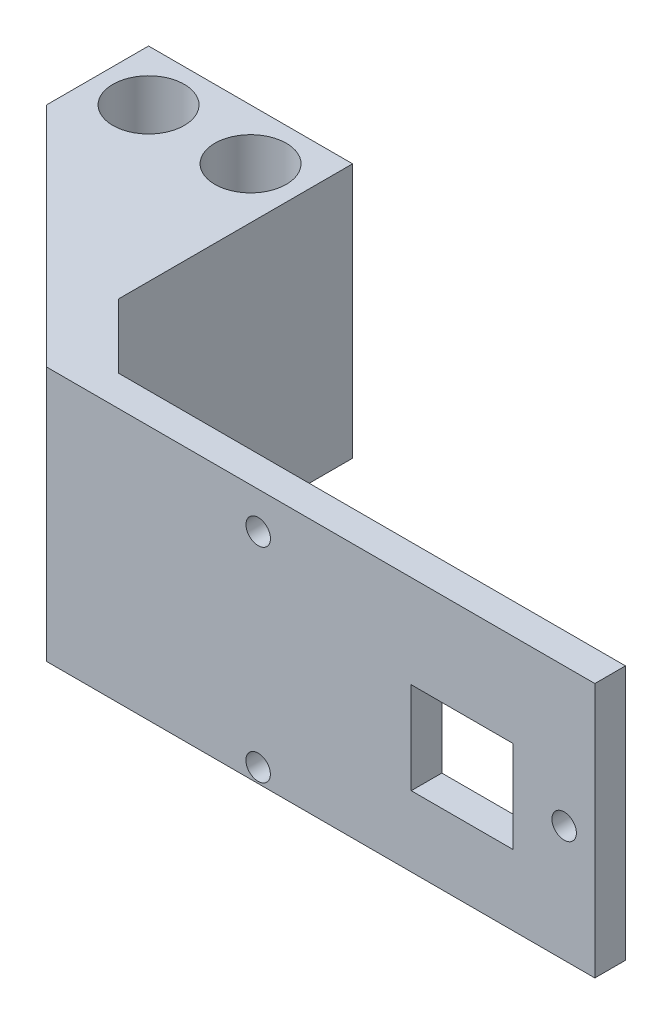
ISO-10303-21;
HEADER;
FILE_DESCRIPTION(('STEP AP214'),'2;1');
FILE_NAME('part.step','',(''),(''),'','','');
FILE_SCHEMA(('AUTOMOTIVE_DESIGN { 1 0 10303 214 1 1 1 1 }'));
ENDSEC;
DATA;
#1=APPLICATION_CONTEXT('core data for automotive mechanical design processes');
#2=APPLICATION_PROTOCOL_DEFINITION('international standard','automotive_design',2000,#1);
#3=PRODUCT_CONTEXT('',#1,'mechanical');
#4=PRODUCT('Part','Part','',(#3));
#5=PRODUCT_RELATED_PRODUCT_CATEGORY('part','',(#4));
#6=PRODUCT_DEFINITION_FORMATION('','',#4);
#7=PRODUCT_DEFINITION_CONTEXT('part definition',#1,'design');
#8=PRODUCT_DEFINITION('design','',#6,#7);
#9=PRODUCT_DEFINITION_SHAPE('','',#8);
#10=(LENGTH_UNIT() NAMED_UNIT(*) SI_UNIT(.MILLI.,.METRE.));
#11=(NAMED_UNIT(*) PLANE_ANGLE_UNIT() SI_UNIT($,.RADIAN.));
#12=(NAMED_UNIT(*) SI_UNIT($,.STERADIAN.) SOLID_ANGLE_UNIT());
#13=UNCERTAINTY_MEASURE_WITH_UNIT(LENGTH_MEASURE(1.E-05),#10,'distance_accuracy_value','');
#14=(GEOMETRIC_REPRESENTATION_CONTEXT(3) GLOBAL_UNCERTAINTY_ASSIGNED_CONTEXT((#13)) GLOBAL_UNIT_ASSIGNED_CONTEXT((#10,
#11,#12)) REPRESENTATION_CONTEXT('',''));
#15=CARTESIAN_POINT('',(0.,0.,0.));
#16=DIRECTION('',(0.,0.,1.));
#17=DIRECTION('',(1.,0.,0.));
#18=AXIS2_PLACEMENT_3D('',#15,#16,#17);
#19=CARTESIAN_POINT('',(-49.6789321882154,25.,0.));
#20=DIRECTION('',(0.,0.,1.));
#21=DIRECTION('',(1.,0.,0.));
#22=AXIS2_PLACEMENT_3D('',#19,#20,#21);
#23=PLANE('',#22);
#24=CARTESIAN_POINT('',(-33.,21.4,0.));
#25=DIRECTION('',(0.,0.,-1.));
#26=DIRECTION('',(-1.,0.,0.));
#27=AXIS2_PLACEMENT_3D('',#24,#25,#26);
#28=CIRCLE('',#27,2.225);
#29=CARTESIAN_POINT('',(-35.225,21.4,0.));
#30=VERTEX_POINT('',#29);
#31=EDGE_CURVE('E264',#30,#30,#28,.T.);
#32=ORIENTED_EDGE('',*,*,#31,.F.);
#33=EDGE_LOOP('',(#32));
#34=FACE_BOUND('',#33,.T.);
#35=CARTESIAN_POINT('',(-3.01000000000001,11.4,0.));
#36=DIRECTION('',(0.,0.,-1.));
#37=DIRECTION('',(-1.,0.,0.));
#38=AXIS2_PLACEMENT_3D('',#35,#36,#37);
#39=CIRCLE('',#38,2.225);
#40=CARTESIAN_POINT('',(-5.23500000000001,11.4,0.));
#41=VERTEX_POINT('',#40);
#42=EDGE_CURVE('E268',#41,#41,#39,.T.);
#43=ORIENTED_EDGE('',*,*,#42,.F.);
#44=EDGE_LOOP('',(#43));
#45=FACE_BOUND('',#44,.T.);
#46=DIRECTION('',(-1.,0.,0.));
#47=VECTOR('',#46,1.);
#48=CARTESIAN_POINT('',(-49.6789321882154,15.8999999999939,0.));
#49=LINE('',#48,#47);
#50=CARTESIAN_POINT('',(-8.00000000000153,15.8999999999939,0.));
#51=VERTEX_POINT('',#50);
#52=CARTESIAN_POINT('',(-18.0000000000015,15.8999999999939,0.));
#53=VERTEX_POINT('',#52);
#54=EDGE_CURVE('E273',#51,#53,#49,.T.);
#55=ORIENTED_EDGE('',*,*,#54,.T.);
#56=DIRECTION('',(0.,-1.,0.));
#57=VECTOR('',#56,1.);
#58=CARTESIAN_POINT('',(-18.0000000000015,25.,0.));
#59=LINE('',#58,#57);
#60=CARTESIAN_POINT('',(-18.0000000000015,6.89999999999394,0.));
#61=VERTEX_POINT('',#60);
#62=EDGE_CURVE('E286',#53,#61,#59,.T.);
#63=ORIENTED_EDGE('',*,*,#62,.T.);
#64=DIRECTION('',(1.,0.,0.));
#65=VECTOR('',#64,1.);
#66=CARTESIAN_POINT('',(-49.6789321882154,6.89999999999393,0.));
#67=LINE('',#66,#65);
#68=CARTESIAN_POINT('',(-8.00000000000153,6.89999999999394,0.));
#69=VERTEX_POINT('',#68);
#70=EDGE_CURVE('E642',#61,#69,#67,.T.);
#71=ORIENTED_EDGE('',*,*,#70,.T.);
#72=DIRECTION('',(0.,1.,0.));
#73=VECTOR('',#72,1.);
#74=CARTESIAN_POINT('',(-8.00000000000153,25.,0.));
#75=LINE('',#74,#73);
#76=EDGE_CURVE('E650',#69,#51,#75,.T.);
#77=ORIENTED_EDGE('',*,*,#76,.T.);
#78=EDGE_LOOP('',(#55,#63,#71,#77));
#79=FACE_BOUND('',#78,.T.);
#80=DIRECTION('',(-1.,0.,0.));
#81=VECTOR('',#80,1.);
#82=CARTESIAN_POINT('',(-49.6789321882154,0.,0.));
#83=LINE('',#82,#81);
#84=CARTESIAN_POINT('',(0.,0.,0.));
#85=VERTEX_POINT('',#84);
#86=CARTESIAN_POINT('',(-31.2722117064573,0.,0.));
#87=VERTEX_POINT('',#86);
#88=EDGE_CURVE('E275',#85,#87,#83,.T.);
#89=ORIENTED_EDGE('',*,*,#88,.T.);
#90=CARTESIAN_POINT('',(-33.008,1.39200000000001,0.));
#91=DIRECTION('',(0.,0.,-1.));
#92=DIRECTION('',(-1.,0.,0.));
#93=AXIS2_PLACEMENT_3D('',#90,#91,#92);
#94=CIRCLE('',#93,2.225);
#95=CARTESIAN_POINT('',(-34.7437882935427,0.,0.));
#96=VERTEX_POINT('',#95);
#97=EDGE_CURVE('E140',#96,#87,#94,.T.);
#98=ORIENTED_EDGE('',*,*,#97,.F.);
#99=CARTESIAN_POINT('',(-49.6789321882154,0.,0.));
#100=VERTEX_POINT('',#99);
#101=EDGE_CURVE('E282',#96,#100,#83,.T.);
#102=ORIENTED_EDGE('',*,*,#101,.T.);
#103=DIRECTION('',(0.,-1.,0.));
#104=VECTOR('',#103,1.);
#105=CARTESIAN_POINT('',(-49.6789321882154,25.,0.));
#106=LINE('',#105,#104);
#107=CARTESIAN_POINT('',(-49.6789321882154,25.,0.));
#108=VERTEX_POINT('',#107);
#109=EDGE_CURVE('E167',#108,#100,#106,.T.);
#110=ORIENTED_EDGE('',*,*,#109,.F.);
#111=DIRECTION('',(-1.,0.,0.));
#112=VECTOR('',#111,1.);
#113=CARTESIAN_POINT('',(-49.6789321882154,25.,0.));
#114=LINE('',#113,#112);
#115=CARTESIAN_POINT('',(0.,25.,0.));
#116=VERTEX_POINT('',#115);
#117=EDGE_CURVE('E302',#116,#108,#114,.T.);
#118=ORIENTED_EDGE('',*,*,#117,.F.);
#119=DIRECTION('',(0.,-1.,0.));
#120=VECTOR('',#119,1.);
#121=CARTESIAN_POINT('',(0.,25.,0.));
#122=LINE('',#121,#120);
#123=EDGE_CURVE('E279',#116,#85,#122,.T.);
#124=ORIENTED_EDGE('',*,*,#123,.T.);
#125=EDGE_LOOP('',(#89,#98,#102,#110,#118,#124));
#126=FACE_BOUND('',#125,.T.);
#127=ADVANCED_FACE('F33',(#34,#45,#79,#126),#23,.F.);
#128=CARTESIAN_POINT('',(-56.0000000000808,25.,-6.32106781186541));
#129=DIRECTION('',(-0.707106781186548,0.,0.707106781186547));
#130=DIRECTION('',(0.707106781186547,0.,0.707106781186548));
#131=AXIS2_PLACEMENT_3D('',#128,#129,#130);
#132=PLANE('',#131);
#133=DIRECTION('',(-0.707106781186547,0.,-0.707106781186548));
#134=VECTOR('',#133,1.);
#135=CARTESIAN_POINT('',(-56.0000000000808,0.,-6.32106781186541));
#136=LINE('',#135,#134);
#137=CARTESIAN_POINT('',(-56.0000000000808,0.,-6.32106781186541));
#138=VERTEX_POINT('',#137);
#139=EDGE_CURVE('E281',#100,#138,#136,.T.);
#140=ORIENTED_EDGE('',*,*,#139,.T.);
#141=DIRECTION('',(0.,-1.,0.));
#142=VECTOR('',#141,1.);
#143=CARTESIAN_POINT('',(-56.0000000000808,25.,-6.32106781186541));
#144=LINE('',#143,#142);
#145=CARTESIAN_POINT('',(-56.0000000000808,25.,-6.32106781186541));
#146=VERTEX_POINT('',#145);
#147=EDGE_CURVE('E318',#146,#138,#144,.T.);
#148=ORIENTED_EDGE('',*,*,#147,.F.);
#149=DIRECTION('',(-0.707106781186547,0.,-0.707106781186548));
#150=VECTOR('',#149,1.);
#151=CARTESIAN_POINT('',(-56.0000000000808,25.,-6.32106781186541));
#152=LINE('',#151,#150);
#153=EDGE_CURVE('E327',#108,#146,#152,.T.);
#154=ORIENTED_EDGE('',*,*,#153,.F.);
#155=ORIENTED_EDGE('',*,*,#109,.T.);
#156=EDGE_LOOP('',(#140,#148,#154,#155));
#157=FACE_BOUND('',#156,.T.);
#158=ADVANCED_FACE('F254',(#157),#132,.F.);
#159=CARTESIAN_POINT('',(-56.0000000000808,25.,-29.2500000000001));
#160=DIRECTION('',(-1.,0.,0.));
#161=DIRECTION('',(0.,0.,1.));
#162=AXIS2_PLACEMENT_3D('',#159,#160,#161);
#163=PLANE('',#162);
#164=DIRECTION('',(0.,0.,-1.));
#165=VECTOR('',#164,1.);
#166=CARTESIAN_POINT('',(-56.0000000000808,0.,-29.2500000000001));
#167=LINE('',#166,#165);
#168=CARTESIAN_POINT('',(-56.0000000000808,0.,-29.2500000000001));
#169=VERTEX_POINT('',#168);
#170=EDGE_CURVE('E284',#138,#169,#167,.T.);
#171=ORIENTED_EDGE('',*,*,#170,.T.);
#172=DIRECTION('',(0.,-1.,0.));
#173=VECTOR('',#172,1.);
#174=CARTESIAN_POINT('',(-56.0000000000808,25.,-29.2500000000001));
#175=LINE('',#174,#173);
#176=CARTESIAN_POINT('',(-56.0000000000808,25.,-29.2500000000001));
#177=VERTEX_POINT('',#176);
#178=EDGE_CURVE('E316',#177,#169,#175,.T.);
#179=ORIENTED_EDGE('',*,*,#178,.F.);
#180=DIRECTION('',(0.,0.,-1.));
#181=VECTOR('',#180,1.);
#182=CARTESIAN_POINT('',(-56.0000000000808,25.,-29.2500000000001));
#183=LINE('',#182,#181);
#184=EDGE_CURVE('E340',#146,#177,#183,.T.);
#185=ORIENTED_EDGE('',*,*,#184,.F.);
#186=ORIENTED_EDGE('',*,*,#147,.T.);
#187=EDGE_LOOP('',(#171,#179,#185,#186));
#188=FACE_BOUND('',#187,.T.);
#189=ADVANCED_FACE('F259',(#188),#163,.F.);
#190=CARTESIAN_POINT('',(-76.0000000000808,25.,-29.2500000000001));
#191=DIRECTION('',(0.,0.,1.));
#192=DIRECTION('',(1.,0.,0.));
#193=AXIS2_PLACEMENT_3D('',#190,#191,#192);
#194=PLANE('',#193);
#195=DIRECTION('',(-1.,0.,0.));
#196=VECTOR('',#195,1.);
#197=CARTESIAN_POINT('',(-76.0000000000808,0.,-29.2500000000001));
#198=LINE('',#197,#196);
#199=CARTESIAN_POINT('',(-76.0000000000808,0.,-29.2500000000001));
#200=VERTEX_POINT('',#199);
#201=EDGE_CURVE('E292',#169,#200,#198,.T.);
#202=ORIENTED_EDGE('',*,*,#201,.T.);
#203=DIRECTION('',(0.,-1.,0.));
#204=VECTOR('',#203,1.);
#205=CARTESIAN_POINT('',(-76.0000000000808,25.,-29.2500000000001));
#206=LINE('',#205,#204);
#207=CARTESIAN_POINT('',(-76.0000000000808,25.,-29.2500000000001));
#208=VERTEX_POINT('',#207);
#209=EDGE_CURVE('E313',#208,#200,#206,.T.);
#210=ORIENTED_EDGE('',*,*,#209,.F.);
#211=DIRECTION('',(-1.,0.,0.));
#212=VECTOR('',#211,1.);
#213=CARTESIAN_POINT('',(-76.0000000000808,25.,-29.2500000000001));
#214=LINE('',#213,#212);
#215=EDGE_CURVE('E336',#177,#208,#214,.T.);
#216=ORIENTED_EDGE('',*,*,#215,.F.);
#217=ORIENTED_EDGE('',*,*,#178,.T.);
#218=EDGE_LOOP('',(#202,#210,#216,#217));
#219=FACE_BOUND('',#218,.T.);
#220=ADVANCED_FACE('F334',(#219),#194,.F.);
#221=CARTESIAN_POINT('',(-76.0000000000808,25.,-19.25));
#222=DIRECTION('',(1.,0.,0.));
#223=DIRECTION('',(0.,0.,-1.));
#224=AXIS2_PLACEMENT_3D('',#221,#222,#223);
#225=PLANE('',#224);
#226=DIRECTION('',(0.,0.,1.));
#227=VECTOR('',#226,1.);
#228=CARTESIAN_POINT('',(-76.0000000000808,0.,-19.25));
#229=LINE('',#228,#227);
#230=CARTESIAN_POINT('',(-76.0000000000808,0.,-19.25));
#231=VERTEX_POINT('',#230);
#232=EDGE_CURVE('E294',#200,#231,#229,.T.);
#233=ORIENTED_EDGE('',*,*,#232,.T.);
#234=DIRECTION('',(0.,-1.,0.));
#235=VECTOR('',#234,1.);
#236=CARTESIAN_POINT('',(-76.0000000000808,25.,-19.25));
#237=LINE('',#236,#235);
#238=CARTESIAN_POINT('',(-76.0000000000808,25.,-19.25));
#239=VERTEX_POINT('',#238);
#240=EDGE_CURVE('E310',#239,#231,#237,.T.);
#241=ORIENTED_EDGE('',*,*,#240,.F.);
#242=DIRECTION('',(0.,0.,1.));
#243=VECTOR('',#242,1.);
#244=CARTESIAN_POINT('',(-76.0000000000808,25.,-19.25));
#245=LINE('',#244,#243);
#246=EDGE_CURVE('E339',#208,#239,#245,.T.);
#247=ORIENTED_EDGE('',*,*,#246,.F.);
#248=ORIENTED_EDGE('',*,*,#209,.T.);
#249=EDGE_LOOP('',(#233,#241,#247,#248));
#250=FACE_BOUND('',#249,.T.);
#251=ADVANCED_FACE('F360',(#250),#225,.F.);
#252=CARTESIAN_POINT('',(-53.7500000000809,25.,3.00000000000001));
#253=DIRECTION('',(0.707106781186549,0.,-0.707106781186546));
#254=DIRECTION('',(-0.707106781186546,0.,-0.707106781186549));
#255=AXIS2_PLACEMENT_3D('',#252,#253,#254);
#256=PLANE('',#255);
#257=DIRECTION('',(0.707106781186546,0.,0.707106781186549));
#258=VECTOR('',#257,1.);
#259=CARTESIAN_POINT('',(-53.7500000000809,0.,3.00000000000001));
#260=LINE('',#259,#258);
#261=CARTESIAN_POINT('',(-53.7500000000809,0.,3.00000000000001));
#262=VERTEX_POINT('',#261);
#263=EDGE_CURVE('E296',#231,#262,#260,.T.);
#264=ORIENTED_EDGE('',*,*,#263,.T.);
#265=DIRECTION('',(0.,-1.,0.));
#266=VECTOR('',#265,1.);
#267=CARTESIAN_POINT('',(-53.7500000000809,25.,3.00000000000001));
#268=LINE('',#267,#266);
#269=CARTESIAN_POINT('',(-53.7500000000809,25.,3.00000000000001));
#270=VERTEX_POINT('',#269);
#271=EDGE_CURVE('E307',#270,#262,#268,.T.);
#272=ORIENTED_EDGE('',*,*,#271,.F.);
#273=DIRECTION('',(0.707106781186546,0.,0.707106781186549));
#274=VECTOR('',#273,1.);
#275=CARTESIAN_POINT('',(-53.7500000000809,25.,3.00000000000001));
#276=LINE('',#275,#274);
#277=EDGE_CURVE('E342',#239,#270,#276,.T.);
#278=ORIENTED_EDGE('',*,*,#277,.F.);
#279=ORIENTED_EDGE('',*,*,#240,.T.);
#280=EDGE_LOOP('',(#264,#272,#278,#279));
#281=FACE_BOUND('',#280,.T.);
#282=ADVANCED_FACE('F357',(#281),#256,.F.);
#283=CARTESIAN_POINT('',(0.,25.,3.));
#284=DIRECTION('',(0.,0.,-1.));
#285=DIRECTION('',(-1.,0.,0.));
#286=AXIS2_PLACEMENT_3D('',#283,#284,#285);
#287=PLANE('',#286);
#288=CARTESIAN_POINT('',(-33.,21.4,3.00000000000001));
#289=DIRECTION('',(0.,0.,-1.));
#290=DIRECTION('',(-1.,0.,0.));
#291=AXIS2_PLACEMENT_3D('',#288,#289,#290);
#292=CIRCLE('',#291,1.2);
#293=CARTESIAN_POINT('',(-34.2,21.4,3.00000000000001));
#294=VERTEX_POINT('',#293);
#295=EDGE_CURVE('E581',#294,#294,#292,.T.);
#296=ORIENTED_EDGE('',*,*,#295,.T.);
#297=EDGE_LOOP('',(#296));
#298=FACE_BOUND('',#297,.T.);
#299=CARTESIAN_POINT('',(-33.008,1.39200000000001,3.00000000000001));
#300=DIRECTION('',(0.,0.,-1.));
#301=DIRECTION('',(-1.,0.,0.));
#302=AXIS2_PLACEMENT_3D('',#299,#300,#301);
#303=CIRCLE('',#302,1.2);
#304=CARTESIAN_POINT('',(-34.208,1.39200000000001,3.00000000000001));
#305=VERTEX_POINT('',#304);
#306=EDGE_CURVE('E589',#305,#305,#303,.T.);
#307=ORIENTED_EDGE('',*,*,#306,.T.);
#308=EDGE_LOOP('',(#307));
#309=FACE_BOUND('',#308,.T.);
#310=CARTESIAN_POINT('',(-3.01000000000001,11.4,3.00000000000001));
#311=DIRECTION('',(0.,0.,-1.));
#312=DIRECTION('',(-1.,0.,0.));
#313=AXIS2_PLACEMENT_3D('',#310,#311,#312);
#314=CIRCLE('',#313,1.2);
#315=CARTESIAN_POINT('',(-4.21000000000002,11.4,3.00000000000001));
#316=VERTEX_POINT('',#315);
#317=EDGE_CURVE('E602',#316,#316,#314,.T.);
#318=ORIENTED_EDGE('',*,*,#317,.T.);
#319=EDGE_LOOP('',(#318));
#320=FACE_BOUND('',#319,.T.);
#321=DIRECTION('',(1.,0.,0.));
#322=VECTOR('',#321,1.);
#323=CARTESIAN_POINT('',(-8.00000000000153,6.89999999999394,3.));
#324=LINE('',#323,#322);
#325=CARTESIAN_POINT('',(-18.0000000000015,6.89999999999394,3.));
#326=VERTEX_POINT('',#325);
#327=CARTESIAN_POINT('',(-8.00000000000153,6.89999999999394,3.));
#328=VERTEX_POINT('',#327);
#329=EDGE_CURVE('E631',#326,#328,#324,.T.);
#330=ORIENTED_EDGE('',*,*,#329,.F.);
#331=DIRECTION('',(0.,-1.,0.));
#332=VECTOR('',#331,1.);
#333=CARTESIAN_POINT('',(-18.0000000000015,6.89999999999394,3.));
#334=LINE('',#333,#332);
#335=CARTESIAN_POINT('',(-18.0000000000015,15.8999999999939,3.));
#336=VERTEX_POINT('',#335);
#337=EDGE_CURVE('E629',#336,#326,#334,.T.);
#338=ORIENTED_EDGE('',*,*,#337,.F.);
#339=DIRECTION('',(-1.,0.,0.));
#340=VECTOR('',#339,1.);
#341=CARTESIAN_POINT('',(-8.00000000000153,15.8999999999939,3.));
#342=LINE('',#341,#340);
#343=CARTESIAN_POINT('',(-8.00000000000153,15.8999999999939,3.));
#344=VERTEX_POINT('',#343);
#345=EDGE_CURVE('E636',#344,#336,#342,.T.);
#346=ORIENTED_EDGE('',*,*,#345,.F.);
#347=DIRECTION('',(0.,1.,0.));
#348=VECTOR('',#347,1.);
#349=CARTESIAN_POINT('',(-8.00000000000153,6.89999999999394,3.));
#350=LINE('',#349,#348);
#351=EDGE_CURVE('E633',#328,#344,#350,.T.);
#352=ORIENTED_EDGE('',*,*,#351,.F.);
#353=EDGE_LOOP('',(#330,#338,#346,#352));
#354=FACE_BOUND('',#353,.T.);
#355=DIRECTION('',(1.,0.,0.));
#356=VECTOR('',#355,1.);
#357=CARTESIAN_POINT('',(0.,0.,3.));
#358=LINE('',#357,#356);
#359=CARTESIAN_POINT('',(0.,0.,3.));
#360=VERTEX_POINT('',#359);
#361=EDGE_CURVE('E298',#262,#360,#358,.T.);
#362=ORIENTED_EDGE('',*,*,#361,.T.);
#363=DIRECTION('',(0.,-1.,0.));
#364=VECTOR('',#363,1.);
#365=CARTESIAN_POINT('',(0.,25.,3.));
#366=LINE('',#365,#364);
#367=CARTESIAN_POINT('',(0.,25.,3.));
#368=VERTEX_POINT('',#367);
#369=EDGE_CURVE('E304',#368,#360,#366,.T.);
#370=ORIENTED_EDGE('',*,*,#369,.F.);
#371=DIRECTION('',(1.,0.,0.));
#372=VECTOR('',#371,1.);
#373=CARTESIAN_POINT('',(0.,25.,3.));
#374=LINE('',#373,#372);
#375=EDGE_CURVE('E347',#270,#368,#374,.T.);
#376=ORIENTED_EDGE('',*,*,#375,.F.);
#377=ORIENTED_EDGE('',*,*,#271,.T.);
#378=EDGE_LOOP('',(#362,#370,#376,#377));
#379=FACE_BOUND('',#378,.T.);
#380=ADVANCED_FACE('F249',(#298,#309,#320,#354,#379),#287,.F.);
#381=CARTESIAN_POINT('',(0.,25.,0.));
#382=DIRECTION('',(-1.,0.,0.));
#383=DIRECTION('',(0.,0.,1.));
#384=AXIS2_PLACEMENT_3D('',#381,#382,#383);
#385=PLANE('',#384);
#386=DIRECTION('',(0.,0.,-1.));
#387=VECTOR('',#386,1.);
#388=CARTESIAN_POINT('',(0.,0.,0.));
#389=LINE('',#388,#387);
#390=EDGE_CURVE('E300',#360,#85,#389,.T.);
#391=ORIENTED_EDGE('',*,*,#390,.T.);
#392=ORIENTED_EDGE('',*,*,#123,.F.);
#393=DIRECTION('',(0.,0.,-1.));
#394=VECTOR('',#393,1.);
#395=CARTESIAN_POINT('',(0.,25.,0.));
#396=LINE('',#395,#394);
#397=EDGE_CURVE('E288',#368,#116,#396,.T.);
#398=ORIENTED_EDGE('',*,*,#397,.F.);
#399=ORIENTED_EDGE('',*,*,#369,.T.);
#400=EDGE_LOOP('',(#391,#392,#398,#399));
#401=FACE_BOUND('',#400,.T.);
#402=ADVANCED_FACE('F243',(#401),#385,.F.);
#403=CARTESIAN_POINT('',(0.,25.,0.));
#404=DIRECTION('',(0.,-1.,0.));
#405=DIRECTION('',(0.,0.,-1.));
#406=AXIS2_PLACEMENT_3D('',#403,#404,#405);
#407=PLANE('',#406);
#408=CARTESIAN_POINT('',(-71.0000000000808,25.,-24.2500000000001));
#409=DIRECTION('',(0.,1.,0.));
#410=DIRECTION('',(0.,0.,1.));
#411=AXIS2_PLACEMENT_3D('',#408,#409,#410);
#412=CIRCLE('',#411,3.5);
#413=CARTESIAN_POINT('',(-71.0000000000808,25.,-20.7500000000001));
#414=VERTEX_POINT('',#413);
#415=EDGE_CURVE('E605',#414,#414,#412,.T.);
#416=ORIENTED_EDGE('',*,*,#415,.F.);
#417=EDGE_LOOP('',(#416));
#418=FACE_BOUND('',#417,.T.);
#419=CARTESIAN_POINT('',(-61.0000000000808,25.,-24.2500000000001));
#420=DIRECTION('',(0.,1.,0.));
#421=DIRECTION('',(0.,0.,1.));
#422=AXIS2_PLACEMENT_3D('',#419,#420,#421);
#423=CIRCLE('',#422,3.5);
#424=CARTESIAN_POINT('',(-61.0000000000808,25.,-20.7500000000001));
#425=VERTEX_POINT('',#424);
#426=EDGE_CURVE('E617',#425,#425,#423,.T.);
#427=ORIENTED_EDGE('',*,*,#426,.F.);
#428=EDGE_LOOP('',(#427));
#429=FACE_BOUND('',#428,.T.);
#430=ORIENTED_EDGE('',*,*,#117,.T.);
#431=ORIENTED_EDGE('',*,*,#153,.T.);
#432=ORIENTED_EDGE('',*,*,#184,.T.);
#433=ORIENTED_EDGE('',*,*,#215,.T.);
#434=ORIENTED_EDGE('',*,*,#246,.T.);
#435=ORIENTED_EDGE('',*,*,#277,.T.);
#436=ORIENTED_EDGE('',*,*,#375,.T.);
#437=ORIENTED_EDGE('',*,*,#397,.T.);
#438=EDGE_LOOP('',(#430,#431,#432,#433,#434,#435,#436,#437));
#439=FACE_BOUND('',#438,.T.);
#440=ADVANCED_FACE('F241',(#418,#429,#439),#407,.F.);
#441=CARTESIAN_POINT('',(0.,0.,0.));
#442=DIRECTION('',(0.,-1.,0.));
#443=DIRECTION('',(0.,0.,-1.));
#444=AXIS2_PLACEMENT_3D('',#441,#442,#443);
#445=PLANE('',#444);
#446=CARTESIAN_POINT('',(-28.3148420487507,0.,-2.670242134499));
#447=CARTESIAN_POINT('',(-28.4046032576652,0.,-2.58418873291923));
#448=CARTESIAN_POINT('',(-28.4944618104861,0.,-2.49823673815881));
#449=CARTESIAN_POINT('',(-28.6744160673026,0.,-2.32658001718227));
#450=CARTESIAN_POINT('',(-28.7645117731186,0.,-2.24087529287485));
#451=CARTESIAN_POINT('',(-29.0352635806352,0.,-1.98415580871544));
#452=CARTESIAN_POINT('',(-29.2163373249376,0.,-1.81358093111765));
#453=CARTESIAN_POINT('',(-29.5796044089868,0.,-1.47462930057654));
#454=CARTESIAN_POINT('',(-29.761793284238,0.,-1.30624778310828));
#455=CARTESIAN_POINT('',(-30.0369539121235,0.,-1.05575630875156));
#456=CARTESIAN_POINT('',(-30.1289819115858,0.,-0.972610451308737));
#457=CARTESIAN_POINT('',(-30.3138491266602,0.,-0.807226486874564));
#458=CARTESIAN_POINT('',(-30.4066883296711,0.,-0.724988365827106));
#459=CARTESIAN_POINT('',(-30.5832375265107,0.,-0.570623215674008));
#460=CARTESIAN_POINT('',(-30.6668386100529,0.,-0.498371832351626));
#461=CARTESIAN_POINT('',(-30.8351297573086,0.,-0.355130555601928));
#462=CARTESIAN_POINT('',(-30.9198199097461,0.,-0.284140766090483));
#463=CARTESIAN_POINT('',(-31.0908965968366,0.,-0.143661179446682));
#464=CARTESIAN_POINT('',(-31.1772877096904,0.,-0.0741769380610332));
#465=CARTESIAN_POINT('',(-31.3519755406488,0.,0.0623399663617847));
#466=CARTESIAN_POINT('',(-31.4402719035342,0.,0.129373080219223));
#467=CARTESIAN_POINT('',(-31.6009615680305,0.,0.246350676203585));
#468=CARTESIAN_POINT('',(-31.6728666524221,0.,0.296961885881215));
#469=CARTESIAN_POINT('',(-31.8188700109861,0.,0.395038462652466));
#470=CARTESIAN_POINT('',(-31.8929694917747,0.,0.442502050718006));
#471=CARTESIAN_POINT('',(-32.0437294112301,0.,0.532710326585476));
#472=CARTESIAN_POINT('',(-32.1203814116365,0.,0.575468874332137));
#473=CARTESIAN_POINT('',(-32.2770274489335,0.,0.654206097287374));
#474=CARTESIAN_POINT('',(-32.3570168559692,0.,0.690193806842403));
#475=CARTESIAN_POINT('',(-32.5231717491351,0.,0.753026814444006));
#476=CARTESIAN_POINT('',(-32.6094448546879,0.,0.779603845856285));
#477=CARTESIAN_POINT('',(-32.7410754537254,0.,0.808284972366491));
#478=CARTESIAN_POINT('',(-32.7852260763254,0.,0.815976704673771));
#479=CARTESIAN_POINT('',(-32.8740573195375,0.,0.82726311058226));
#480=CARTESIAN_POINT('',(-32.9187378847478,0.,0.830858208709141));
#481=CARTESIAN_POINT('',(-33.0085335738166,0.,0.833728237602551));
#482=CARTESIAN_POINT('',(-33.0536496231703,0.,0.832974603307252));
#483=CARTESIAN_POINT('',(-33.1435972054801,0.,0.827131776360703));
#484=CARTESIAN_POINT('',(-33.1884287222393,0.,0.822042339084477));
#485=CARTESIAN_POINT('',(-33.2776254567695,0.,0.807814984803786));
#486=CARTESIAN_POINT('',(-33.3219879610265,0.,0.798660324348874));
#487=CARTESIAN_POINT('',(-33.409816591045,0.,0.776790640386202));
#488=CARTESIAN_POINT('',(-33.4532825879662,0.,0.7640751089086));
#489=CARTESIAN_POINT('',(-33.5817514474391,0.,0.721558926641909));
#490=CARTESIAN_POINT('',(-33.6652791422371,0.,0.687305708051299));
#491=CARTESIAN_POINT('',(-33.8285697214172,0.,0.610759458861687));
#492=CARTESIAN_POINT('',(-33.9083257307649,0.,0.568452403354447));
#493=CARTESIAN_POINT('',(-34.0658585738787,0.,0.477852378083364));
#494=CARTESIAN_POINT('',(-34.1435902239212,0.,0.429481822002491));
#495=CARTESIAN_POINT('',(-34.2582887406243,0.,0.354154226442494));
#496=CARTESIAN_POINT('',(-34.2961910488015,0.,0.328593303054234));
#497=CARTESIAN_POINT('',(-34.371453487613,0.,0.276686323900357));
#498=CARTESIAN_POINT('',(-34.4088136369541,0.,0.25034029532054));
#499=CARTESIAN_POINT('',(-34.5239963956909,0.,0.167586385564047));
#500=CARTESIAN_POINT('',(-34.6010151425868,0.,0.110060565372586));
#501=CARTESIAN_POINT('',(-34.7534837661103,0.,-0.00704008728399211));
#502=CARTESIAN_POINT('',(-34.8289334068516,0.,-0.0666152243042237));
#503=CARTESIAN_POINT('',(-34.9786526408805,0.,-0.187295994774762));
#504=CARTESIAN_POINT('',(-35.0529216745342,0.,-0.248402320647526));
#505=CARTESIAN_POINT('',(-35.2005096939831,0.,-0.3717535549779));
#506=CARTESIAN_POINT('',(-35.2738286447611,0.,-0.433998505199194));
#507=CARTESIAN_POINT('',(-35.4929934280121,0.,-0.622317617150357));
#508=CARTESIAN_POINT('',(-35.6377122827571,0.,-0.749701868550061));
#509=CARTESIAN_POINT('',(-35.9251504472674,0.,-1.00661282843773));
#510=CARTESIAN_POINT('',(-36.0678702977995,0.,-1.13613893599998));
#511=CARTESIAN_POINT('',(-36.3359675285231,0.,-1.382008992756));
#512=CARTESIAN_POINT('',(-36.4614890577244,0.,-1.49819599234736));
#513=CARTESIAN_POINT('',(-36.7117470745233,0.,-1.73143193172807));
#514=CARTESIAN_POINT('',(-36.8364834960293,0.,-1.84848094232954));
#515=CARTESIAN_POINT('',(-37.0848134269308,0.,-2.08271082590843));
#516=CARTESIAN_POINT('',(-37.2084095464,0.,-2.19988893456972));
#517=CARTESIAN_POINT('',(-37.4551146908246,0.,-2.43473166416725));
#518=CARTESIAN_POINT('',(-37.5782237644966,0.,-2.55239623390753));
#519=CARTESIAN_POINT('',(-37.7011579512493,0.,-2.670242134499));
#520=B_SPLINE_CURVE_WITH_KNOTS('',3,(#446,#447,#448,#449,#450,#451,#452,#453,#454,#455,#456,
#457,#458,#459,#460,#461,#462,#463,#464,#465,#466,#467,#468,#469,#470,#471,#472,#473,#474,#475,
#476,#477,#478,#479,#480,#481,#482,#483,#484,#485,#486,#487,#488,#489,#490,#491,#492,#493,#494,
#495,#496,#497,#498,#499,#500,#501,#502,#503,#504,#505,#506,#507,#508,#509,#510,#511,#512,#513,
#514,#515,#516,#517,#518,#519),.UNSPECIFIED.,.F.,.F.,(4,2,2,2,2,2,2,2,2,2,2,2,2,2,2,2,2,2,2,2,2,
2,2,2,2,2,2,2,2,2,2,2,2,2,2,2,4),(0.,0.373042051546419,0.74608697499503,1.49237253057729,
2.23660007640865,2.60867306350557,2.9807402810256,3.31221965930799,3.64372621574491,
3.97629848184712,4.30880926918905,4.57254284729972,4.8364242384692,5.0995062217447,
5.36223464517354,5.63194249608236,5.76622549680776,5.90049458079945,6.03564662368739,
6.17080629232657,6.30652788276435,6.44226884420001,6.71238006782374,6.98296603716902,
7.25745763858363,7.39459928794342,7.53173619401115,7.82007383343288,8.10845451029174,
8.39696803772735,8.6854921688751,9.26383849783315,9.84202522831144,10.3551432236519,
10.8683038513208,11.379243025799,11.8901297315975),.UNSPECIFIED.);
#521=CARTESIAN_POINT('',(-31.3043756282561,0.,0.0250000000000005));
#522=VERTEX_POINT('',#521);
#523=EDGE_CURVE('E11',#87,#522,#520,.T.);
#524=ORIENTED_EDGE('',*,*,#523,.F.);
#525=ORIENTED_EDGE('',*,*,#88,.F.);
#526=ORIENTED_EDGE('',*,*,#390,.F.);
#527=ORIENTED_EDGE('',*,*,#361,.F.);
#528=ORIENTED_EDGE('',*,*,#263,.F.);
#529=ORIENTED_EDGE('',*,*,#232,.F.);
#530=ORIENTED_EDGE('',*,*,#201,.F.);
#531=ORIENTED_EDGE('',*,*,#170,.F.);
#532=ORIENTED_EDGE('',*,*,#139,.F.);
#533=ORIENTED_EDGE('',*,*,#101,.F.);
#534=CARTESIAN_POINT('',(-34.7116243717445,0.,0.0249999999998067));
#535=VERTEX_POINT('',#534);
#536=EDGE_CURVE('E42',#535,#96,#520,.T.);
#537=ORIENTED_EDGE('',*,*,#536,.F.);
#538=DIRECTION('',(0.,0.,-1.));
#539=VECTOR('',#538,1.);
#540=CARTESIAN_POINT('',(-34.711624371744,0.,0.));
#541=LINE('',#540,#539);
#542=CARTESIAN_POINT('',(-34.711624371744,0.,1.));
#543=VERTEX_POINT('',#542);
#544=EDGE_CURVE('E150',#543,#535,#541,.T.);
#545=ORIENTED_EDGE('',*,*,#544,.F.);
#546=DIRECTION('',(-1.,0.,0.));
#547=VECTOR('',#546,1.);
#548=CARTESIAN_POINT('',(0.,0.,1.));
#549=LINE('',#548,#547);
#550=CARTESIAN_POINT('',(-31.3043756282561,0.,1.));
#551=VERTEX_POINT('',#550);
#552=EDGE_CURVE('E157',#551,#543,#549,.T.);
#553=ORIENTED_EDGE('',*,*,#552,.F.);
#554=DIRECTION('',(0.,0.,-1.));
#555=VECTOR('',#554,1.);
#556=CARTESIAN_POINT('',(-31.3043756282561,0.,0.));
#557=LINE('',#556,#555);
#558=EDGE_CURVE('E36',#522,#551,#557,.F.);
#559=ORIENTED_EDGE('',*,*,#558,.F.);
#560=EDGE_LOOP('',(#524,#525,#526,#527,#528,#529,#530,#531,#532,#533,#537,#545,#553,#559));
#561=FACE_BOUND('',#560,.T.);
#562=CARTESIAN_POINT('',(-71.0000000000808,0.,-24.2500000000001));
#563=DIRECTION('',(0.,1.,0.));
#564=DIRECTION('',(0.,0.,1.));
#565=AXIS2_PLACEMENT_3D('',#562,#563,#564);
#566=CIRCLE('',#565,1.69999999999999);
#567=CARTESIAN_POINT('',(-71.0000000000808,0.,-22.5500000000001));
#568=VERTEX_POINT('',#567);
#569=EDGE_CURVE('E614',#568,#568,#566,.T.);
#570=ORIENTED_EDGE('',*,*,#569,.T.);
#571=EDGE_LOOP('',(#570));
#572=FACE_BOUND('',#571,.T.);
#573=CARTESIAN_POINT('',(-61.0000000000808,0.,-24.2500000000001));
#574=DIRECTION('',(0.,1.,0.));
#575=DIRECTION('',(0.,0.,1.));
#576=AXIS2_PLACEMENT_3D('',#573,#574,#575);
#577=CIRCLE('',#576,1.69999999999999);
#578=CARTESIAN_POINT('',(-61.0000000000808,0.,-22.5500000000001));
#579=VERTEX_POINT('',#578);
#580=EDGE_CURVE('E626',#579,#579,#577,.T.);
#581=ORIENTED_EDGE('',*,*,#580,.T.);
#582=EDGE_LOOP('',(#581));
#583=FACE_BOUND('',#582,.T.);
#584=ADVANCED_FACE('F155',(#561,#572,#583),#445,.T.);
#585=CARTESIAN_POINT('',(-18.0000000000015,6.89999999999394,-29.2500000000001));
#586=DIRECTION('',(-1.,0.,0.));
#587=DIRECTION('',(0.,0.,1.));
#588=AXIS2_PLACEMENT_3D('',#585,#586,#587);
#589=PLANE('',#588);
#590=DIRECTION('',(0.,0.,1.));
#591=VECTOR('',#590,1.);
#592=CARTESIAN_POINT('',(-18.0000000000015,15.8999999999939,-29.2500000000001));
#593=LINE('',#592,#591);
#594=EDGE_CURVE('E640',#53,#336,#593,.T.);
#595=ORIENTED_EDGE('',*,*,#594,.T.);
#596=ORIENTED_EDGE('',*,*,#337,.T.);
#597=DIRECTION('',(0.,0.,1.));
#598=VECTOR('',#597,1.);
#599=CARTESIAN_POINT('',(-18.0000000000015,6.89999999999394,-29.2500000000001));
#600=LINE('',#599,#598);
#601=EDGE_CURVE('E639',#61,#326,#600,.T.);
#602=ORIENTED_EDGE('',*,*,#601,.F.);
#603=ORIENTED_EDGE('',*,*,#62,.F.);
#604=EDGE_LOOP('',(#595,#596,#602,#603));
#605=FACE_BOUND('',#604,.T.);
#606=ADVANCED_FACE('F232',(#605),#589,.F.);
#607=CARTESIAN_POINT('',(-8.00000000000153,15.8999999999939,-29.2500000000001));
#608=DIRECTION('',(0.,1.,0.));
#609=DIRECTION('',(0.,0.,1.));
#610=AXIS2_PLACEMENT_3D('',#607,#608,#609);
#611=PLANE('',#610);
#612=DIRECTION('',(0.,0.,1.));
#613=VECTOR('',#612,1.);
#614=CARTESIAN_POINT('',(-8.00000000000153,15.8999999999939,-29.2500000000001));
#615=LINE('',#614,#613);
#616=EDGE_CURVE('E643',#51,#344,#615,.T.);
#617=ORIENTED_EDGE('',*,*,#616,.T.);
#618=ORIENTED_EDGE('',*,*,#345,.T.);
#619=ORIENTED_EDGE('',*,*,#594,.F.);
#620=ORIENTED_EDGE('',*,*,#54,.F.);
#621=EDGE_LOOP('',(#617,#618,#619,#620));
#622=FACE_BOUND('',#621,.T.);
#623=ADVANCED_FACE('F228',(#622),#611,.F.);
#624=CARTESIAN_POINT('',(-8.00000000000153,6.89999999999394,-29.2500000000001));
#625=DIRECTION('',(1.,0.,0.));
#626=DIRECTION('',(0.,0.,-1.));
#627=AXIS2_PLACEMENT_3D('',#624,#625,#626);
#628=PLANE('',#627);
#629=DIRECTION('',(0.,0.,1.));
#630=VECTOR('',#629,1.);
#631=CARTESIAN_POINT('',(-8.00000000000153,6.89999999999394,-29.2500000000001));
#632=LINE('',#631,#630);
#633=EDGE_CURVE('E56',#69,#328,#632,.T.);
#634=ORIENTED_EDGE('',*,*,#633,.T.);
#635=ORIENTED_EDGE('',*,*,#351,.T.);
#636=ORIENTED_EDGE('',*,*,#616,.F.);
#637=ORIENTED_EDGE('',*,*,#76,.F.);
#638=EDGE_LOOP('',(#634,#635,#636,#637));
#639=FACE_BOUND('',#638,.T.);
#640=ADVANCED_FACE('F231',(#639),#628,.F.);
#641=CARTESIAN_POINT('',(-8.00000000000153,6.89999999999394,-29.2500000000001));
#642=DIRECTION('',(0.,-1.,0.));
#643=DIRECTION('',(1.,0.,0.));
#644=AXIS2_PLACEMENT_3D('',#641,#642,#643);
#645=PLANE('',#644);
#646=ORIENTED_EDGE('',*,*,#601,.T.);
#647=ORIENTED_EDGE('',*,*,#329,.T.);
#648=ORIENTED_EDGE('',*,*,#633,.F.);
#649=ORIENTED_EDGE('',*,*,#70,.F.);
#650=EDGE_LOOP('',(#646,#647,#648,#649));
#651=FACE_BOUND('',#650,.T.);
#652=ADVANCED_FACE('F226',(#651),#645,.F.);
#653=CARTESIAN_POINT('',(-61.0000000000808,25.,-24.2500000000001));
#654=DIRECTION('',(0.,1.,0.));
#655=DIRECTION('',(0.,0.,1.));
#656=AXIS2_PLACEMENT_3D('',#653,#654,#655);
#657=CYLINDRICAL_SURFACE('',#656,1.7);
#658=ORIENTED_EDGE('',*,*,#580,.F.);
#659=EDGE_LOOP('',(#658));
#660=FACE_BOUND('',#659,.T.);
#661=CARTESIAN_POINT('',(-61.0000000000808,20.,-24.2500000000001));
#662=DIRECTION('',(0.,1.,0.));
#663=DIRECTION('',(0.,0.,1.));
#664=AXIS2_PLACEMENT_3D('',#661,#662,#663);
#665=CIRCLE('',#664,1.7);
#666=CARTESIAN_POINT('',(-61.0000000000808,20.,-22.5500000000001));
#667=VERTEX_POINT('',#666);
#668=EDGE_CURVE('E623',#667,#667,#665,.T.);
#669=ORIENTED_EDGE('',*,*,#668,.T.);
#670=EDGE_LOOP('',(#669));
#671=FACE_BOUND('',#670,.T.);
#672=ADVANCED_FACE('F222',(#660,#671),#657,.F.);
#673=CARTESIAN_POINT('',(-59.3000000000808,20.,-24.2500000000001));
#674=DIRECTION('',(0.,-1.,0.));
#675=DIRECTION('',(0.,0.,-1.));
#676=AXIS2_PLACEMENT_3D('',#673,#674,#675);
#677=PLANE('',#676);
#678=ORIENTED_EDGE('',*,*,#668,.F.);
#679=EDGE_LOOP('',(#678));
#680=FACE_BOUND('',#679,.T.);
#681=CARTESIAN_POINT('',(-61.0000000000808,20.,-24.2500000000001));
#682=DIRECTION('',(0.,1.,0.));
#683=DIRECTION('',(0.,0.,1.));
#684=AXIS2_PLACEMENT_3D('',#681,#682,#683);
#685=CIRCLE('',#684,3.5);
#686=CARTESIAN_POINT('',(-61.0000000000808,20.,-20.7500000000001));
#687=VERTEX_POINT('',#686);
#688=EDGE_CURVE('E620',#687,#687,#685,.T.);
#689=ORIENTED_EDGE('',*,*,#688,.T.);
#690=EDGE_LOOP('',(#689));
#691=FACE_BOUND('',#690,.T.);
#692=ADVANCED_FACE('F218',(#680,#691),#677,.F.);
#693=CARTESIAN_POINT('',(-61.0000000000808,25.,-24.2500000000001));
#694=DIRECTION('',(0.,1.,0.));
#695=DIRECTION('',(0.,0.,1.));
#696=AXIS2_PLACEMENT_3D('',#693,#694,#695);
#697=CYLINDRICAL_SURFACE('',#696,3.5);
#698=ORIENTED_EDGE('',*,*,#688,.F.);
#699=EDGE_LOOP('',(#698));
#700=FACE_BOUND('',#699,.T.);
#701=ORIENTED_EDGE('',*,*,#426,.T.);
#702=EDGE_LOOP('',(#701));
#703=FACE_BOUND('',#702,.T.);
#704=ADVANCED_FACE('F214',(#700,#703),#697,.F.);
#705=CARTESIAN_POINT('',(-71.0000000000808,25.,-24.2500000000001));
#706=DIRECTION('',(0.,1.,0.));
#707=DIRECTION('',(0.,0.,1.));
#708=AXIS2_PLACEMENT_3D('',#705,#706,#707);
#709=CYLINDRICAL_SURFACE('',#708,1.7);
#710=ORIENTED_EDGE('',*,*,#569,.F.);
#711=EDGE_LOOP('',(#710));
#712=FACE_BOUND('',#711,.T.);
#713=CARTESIAN_POINT('',(-71.0000000000808,20.,-24.2500000000001));
#714=DIRECTION('',(0.,1.,0.));
#715=DIRECTION('',(0.,0.,1.));
#716=AXIS2_PLACEMENT_3D('',#713,#714,#715);
#717=CIRCLE('',#716,1.70000000000001);
#718=CARTESIAN_POINT('',(-71.0000000000808,20.,-22.5500000000001));
#719=VERTEX_POINT('',#718);
#720=EDGE_CURVE('E611',#719,#719,#717,.T.);
#721=ORIENTED_EDGE('',*,*,#720,.T.);
#722=EDGE_LOOP('',(#721));
#723=FACE_BOUND('',#722,.T.);
#724=ADVANCED_FACE('F210',(#712,#723),#709,.F.);
#725=CARTESIAN_POINT('',(-69.3000000000808,20.,-24.2500000000001));
#726=DIRECTION('',(0.,-1.,0.));
#727=DIRECTION('',(0.,0.,-1.));
#728=AXIS2_PLACEMENT_3D('',#725,#726,#727);
#729=PLANE('',#728);
#730=ORIENTED_EDGE('',*,*,#720,.F.);
#731=EDGE_LOOP('',(#730));
#732=FACE_BOUND('',#731,.T.);
#733=CARTESIAN_POINT('',(-71.0000000000808,20.,-24.2500000000001));
#734=DIRECTION('',(0.,1.,0.));
#735=DIRECTION('',(0.,0.,1.));
#736=AXIS2_PLACEMENT_3D('',#733,#734,#735);
#737=CIRCLE('',#736,3.5);
#738=CARTESIAN_POINT('',(-71.0000000000808,20.,-20.7500000000001));
#739=VERTEX_POINT('',#738);
#740=EDGE_CURVE('E608',#739,#739,#737,.T.);
#741=ORIENTED_EDGE('',*,*,#740,.T.);
#742=EDGE_LOOP('',(#741));
#743=FACE_BOUND('',#742,.T.);
#744=ADVANCED_FACE('F206',(#732,#743),#729,.F.);
#745=CARTESIAN_POINT('',(-71.0000000000808,25.,-24.2500000000001));
#746=DIRECTION('',(0.,1.,0.));
#747=DIRECTION('',(0.,0.,1.));
#748=AXIS2_PLACEMENT_3D('',#745,#746,#747);
#749=CYLINDRICAL_SURFACE('',#748,3.5);
#750=ORIENTED_EDGE('',*,*,#740,.F.);
#751=EDGE_LOOP('',(#750));
#752=FACE_BOUND('',#751,.T.);
#753=ORIENTED_EDGE('',*,*,#415,.T.);
#754=EDGE_LOOP('',(#753));
#755=FACE_BOUND('',#754,.T.);
#756=ADVANCED_FACE('F202',(#752,#755),#749,.F.);
#757=CARTESIAN_POINT('',(-3.01000000000001,11.4,0.));
#758=DIRECTION('',(0.,0.,-1.));
#759=DIRECTION('',(-1.,0.,0.));
#760=AXIS2_PLACEMENT_3D('',#757,#758,#759);
#761=CYLINDRICAL_SURFACE('',#760,1.2);
#762=ORIENTED_EDGE('',*,*,#317,.F.);
#763=EDGE_LOOP('',(#762));
#764=FACE_BOUND('',#763,.T.);
#765=CARTESIAN_POINT('',(-3.01000000000001,11.4,1.));
#766=DIRECTION('',(0.,0.,-1.));
#767=DIRECTION('',(-1.,0.,0.));
#768=AXIS2_PLACEMENT_3D('',#765,#766,#767);
#769=CIRCLE('',#768,1.2);
#770=CARTESIAN_POINT('',(-4.21000000000002,11.4,1.));
#771=VERTEX_POINT('',#770);
#772=EDGE_CURVE('E599',#771,#771,#769,.T.);
#773=ORIENTED_EDGE('',*,*,#772,.T.);
#774=EDGE_LOOP('',(#773));
#775=FACE_BOUND('',#774,.T.);
#776=ADVANCED_FACE('F198',(#764,#775),#761,.F.);
#777=CARTESIAN_POINT('',(-0.810000000000013,11.4,1.));
#778=DIRECTION('',(0.,0.,1.));
#779=DIRECTION('',(1.,0.,0.));
#780=AXIS2_PLACEMENT_3D('',#777,#778,#779);
#781=PLANE('',#780);
#782=ORIENTED_EDGE('',*,*,#772,.F.);
#783=EDGE_LOOP('',(#782));
#784=FACE_BOUND('',#783,.T.);
#785=CARTESIAN_POINT('',(-3.01000000000001,11.4,1.));
#786=DIRECTION('',(0.,0.,-1.));
#787=DIRECTION('',(-1.,0.,0.));
#788=AXIS2_PLACEMENT_3D('',#785,#786,#787);
#789=CIRCLE('',#788,2.2);
#790=CARTESIAN_POINT('',(-5.21000000000001,11.4,1.));
#791=VERTEX_POINT('',#790);
#792=EDGE_CURVE('E596',#791,#791,#789,.T.);
#793=ORIENTED_EDGE('',*,*,#792,.T.);
#794=EDGE_LOOP('',(#793));
#795=FACE_BOUND('',#794,.T.);
#796=ADVANCED_FACE('F194',(#784,#795),#781,.F.);
#797=CARTESIAN_POINT('',(-3.01000000000001,11.4,0.));
#798=DIRECTION('',(0.,0.,-1.));
#799=DIRECTION('',(-1.,0.,0.));
#800=AXIS2_PLACEMENT_3D('',#797,#798,#799);
#801=CYLINDRICAL_SURFACE('',#800,2.2);
#802=ORIENTED_EDGE('',*,*,#792,.F.);
#803=EDGE_LOOP('',(#802));
#804=FACE_BOUND('',#803,.T.);
#805=CARTESIAN_POINT('',(-3.01000000000001,11.4,0.0250000000000005));
#806=DIRECTION('',(0.,0.,-1.));
#807=DIRECTION('',(-1.,0.,0.));
#808=AXIS2_PLACEMENT_3D('',#805,#806,#807);
#809=CIRCLE('',#808,2.2);
#810=CARTESIAN_POINT('',(-5.21000000000001,11.4,0.0250000000000005));
#811=VERTEX_POINT('',#810);
#812=EDGE_CURVE('E593',#811,#811,#809,.T.);
#813=ORIENTED_EDGE('',*,*,#812,.T.);
#814=EDGE_LOOP('',(#813));
#815=FACE_BOUND('',#814,.T.);
#816=ADVANCED_FACE('F190',(#804,#815),#801,.F.);
#817=CARTESIAN_POINT('',(-3.01000000000001,11.4,0.));
#818=DIRECTION('',(0.,0.,-1.));
#819=DIRECTION('',(-1.,0.,0.));
#820=AXIS2_PLACEMENT_3D('',#817,#818,#819);
#821=CONICAL_SURFACE('',#820,2.225,0.785398163397453);
#822=ORIENTED_EDGE('',*,*,#812,.F.);
#823=EDGE_LOOP('',(#822));
#824=FACE_BOUND('',#823,.T.);
#825=ORIENTED_EDGE('',*,*,#42,.T.);
#826=EDGE_LOOP('',(#825));
#827=FACE_BOUND('',#826,.T.);
#828=ADVANCED_FACE('F186',(#824,#827),#821,.F.);
#829=CARTESIAN_POINT('',(-33.008,1.39200000000001,0.));
#830=DIRECTION('',(0.,0.,-1.));
#831=DIRECTION('',(-1.,0.,0.));
#832=AXIS2_PLACEMENT_3D('',#829,#830,#831);
#833=CYLINDRICAL_SURFACE('',#832,1.2);
#834=ORIENTED_EDGE('',*,*,#306,.F.);
#835=EDGE_LOOP('',(#834));
#836=FACE_BOUND('',#835,.T.);
#837=CARTESIAN_POINT('',(-33.008,1.39200000000001,1.));
#838=DIRECTION('',(0.,0.,-1.));
#839=DIRECTION('',(-1.,0.,0.));
#840=AXIS2_PLACEMENT_3D('',#837,#838,#839);
#841=CIRCLE('',#840,1.20000000000001);
#842=CARTESIAN_POINT('',(-34.208,1.39200000000001,1.));
#843=VERTEX_POINT('',#842);
#844=EDGE_CURVE('E586',#843,#843,#841,.T.);
#845=ORIENTED_EDGE('',*,*,#844,.T.);
#846=EDGE_LOOP('',(#845));
#847=FACE_BOUND('',#846,.T.);
#848=ADVANCED_FACE('F183',(#836,#847),#833,.F.);
#849=CARTESIAN_POINT('',(-30.808,1.39200000000001,1.));
#850=DIRECTION('',(0.,0.,1.));
#851=DIRECTION('',(1.,0.,0.));
#852=AXIS2_PLACEMENT_3D('',#849,#850,#851);
#853=PLANE('',#852);
#854=ORIENTED_EDGE('',*,*,#552,.T.);
#855=CARTESIAN_POINT('',(-33.008,1.39200000000001,1.));
#856=DIRECTION('',(0.,0.,-1.));
#857=DIRECTION('',(-1.,0.,0.));
#858=AXIS2_PLACEMENT_3D('',#855,#856,#857);
#859=CIRCLE('',#858,2.2);
#860=EDGE_CURVE('E152',#543,#551,#859,.T.);
#861=ORIENTED_EDGE('',*,*,#860,.T.);
#862=EDGE_LOOP('',(#854,#861));
#863=FACE_BOUND('',#862,.T.);
#864=ORIENTED_EDGE('',*,*,#844,.F.);
#865=EDGE_LOOP('',(#864));
#866=FACE_BOUND('',#865,.T.);
#867=ADVANCED_FACE('F180',(#863,#866),#853,.F.);
#868=CARTESIAN_POINT('',(-33.008,1.39200000000001,0.));
#869=DIRECTION('',(0.,0.,-1.));
#870=DIRECTION('',(-1.,0.,0.));
#871=AXIS2_PLACEMENT_3D('',#868,#869,#870);
#872=CYLINDRICAL_SURFACE('',#871,2.2);
#873=ORIENTED_EDGE('',*,*,#544,.T.);
#874=CARTESIAN_POINT('',(-33.008,1.39200000000001,0.0250000000000005));
#875=DIRECTION('',(0.,0.,-1.));
#876=DIRECTION('',(-1.,0.,0.));
#877=AXIS2_PLACEMENT_3D('',#874,#875,#876);
#878=CIRCLE('',#877,2.2);
#879=EDGE_CURVE('E48',#535,#522,#878,.T.);
#880=ORIENTED_EDGE('',*,*,#879,.T.);
#881=ORIENTED_EDGE('',*,*,#558,.T.);
#882=ORIENTED_EDGE('',*,*,#860,.F.);
#883=EDGE_LOOP('',(#873,#880,#881,#882));
#884=FACE_BOUND('',#883,.T.);
#885=ADVANCED_FACE('F146',(#884),#872,.F.);
#886=CARTESIAN_POINT('',(-33.008,1.39200000000001,0.));
#887=DIRECTION('',(0.,0.,-1.));
#888=DIRECTION('',(-1.,0.,0.));
#889=AXIS2_PLACEMENT_3D('',#886,#887,#888);
#890=CONICAL_SURFACE('',#889,2.225,0.785398163397453);
#891=ORIENTED_EDGE('',*,*,#523,.T.);
#892=ORIENTED_EDGE('',*,*,#879,.F.);
#893=ORIENTED_EDGE('',*,*,#536,.T.);
#894=ORIENTED_EDGE('',*,*,#97,.T.);
#895=EDGE_LOOP('',(#891,#892,#893,#894));
#896=FACE_BOUND('',#895,.T.);
#897=ADVANCED_FACE('F138',(#896),#890,.F.);
#898=CARTESIAN_POINT('',(-33.,21.4,0.));
#899=DIRECTION('',(0.,0.,-1.));
#900=DIRECTION('',(-1.,0.,0.));
#901=AXIS2_PLACEMENT_3D('',#898,#899,#900);
#902=CYLINDRICAL_SURFACE('',#901,1.2);
#903=ORIENTED_EDGE('',*,*,#295,.F.);
#904=EDGE_LOOP('',(#903));
#905=FACE_BOUND('',#904,.T.);
#906=CARTESIAN_POINT('',(-33.,21.4,1.));
#907=DIRECTION('',(0.,0.,-1.));
#908=DIRECTION('',(-1.,0.,0.));
#909=AXIS2_PLACEMENT_3D('',#906,#907,#908);
#910=CIRCLE('',#909,1.20000000000001);
#911=CARTESIAN_POINT('',(-34.2,21.4,1.));
#912=VERTEX_POINT('',#911);
#913=EDGE_CURVE('E578',#912,#912,#910,.T.);
#914=ORIENTED_EDGE('',*,*,#913,.T.);
#915=EDGE_LOOP('',(#914));
#916=FACE_BOUND('',#915,.T.);
#917=ADVANCED_FACE('F176',(#905,#916),#902,.F.);
#918=CARTESIAN_POINT('',(-30.8,21.4,1.));
#919=DIRECTION('',(0.,0.,1.));
#920=DIRECTION('',(1.,0.,0.));
#921=AXIS2_PLACEMENT_3D('',#918,#919,#920);
#922=PLANE('',#921);
#923=ORIENTED_EDGE('',*,*,#913,.F.);
#924=EDGE_LOOP('',(#923));
#925=FACE_BOUND('',#924,.T.);
#926=CARTESIAN_POINT('',(-33.,21.4,1.));
#927=DIRECTION('',(0.,0.,-1.));
#928=DIRECTION('',(-1.,0.,0.));
#929=AXIS2_PLACEMENT_3D('',#926,#927,#928);
#930=CIRCLE('',#929,2.2);
#931=CARTESIAN_POINT('',(-35.2,21.4,1.));
#932=VERTEX_POINT('',#931);
#933=EDGE_CURVE('E573',#932,#932,#930,.T.);
#934=ORIENTED_EDGE('',*,*,#933,.T.);
#935=EDGE_LOOP('',(#934));
#936=FACE_BOUND('',#935,.T.);
#937=ADVANCED_FACE('F536',(#925,#936),#922,.F.);
#938=CARTESIAN_POINT('',(-33.,21.4,0.));
#939=DIRECTION('',(0.,0.,-1.));
#940=DIRECTION('',(-1.,0.,0.));
#941=AXIS2_PLACEMENT_3D('',#938,#939,#940);
#942=CYLINDRICAL_SURFACE('',#941,2.2);
#943=ORIENTED_EDGE('',*,*,#933,.F.);
#944=EDGE_LOOP('',(#943));
#945=FACE_BOUND('',#944,.T.);
#946=CARTESIAN_POINT('',(-33.,21.4,0.0250000000000005));
#947=DIRECTION('',(0.,0.,-1.));
#948=DIRECTION('',(-1.,0.,0.));
#949=AXIS2_PLACEMENT_3D('',#946,#947,#948);
#950=CIRCLE('',#949,2.2);
#951=CARTESIAN_POINT('',(-35.2,21.4,0.0250000000000005));
#952=VERTEX_POINT('',#951);
#953=EDGE_CURVE('E571',#952,#952,#950,.T.);
#954=ORIENTED_EDGE('',*,*,#953,.T.);
#955=EDGE_LOOP('',(#954));
#956=FACE_BOUND('',#955,.T.);
#957=ADVANCED_FACE('F545',(#945,#956),#942,.F.);
#958=CARTESIAN_POINT('',(-33.,21.4,0.));
#959=DIRECTION('',(0.,0.,-1.));
#960=DIRECTION('',(-1.,0.,0.));
#961=AXIS2_PLACEMENT_3D('',#958,#959,#960);
#962=CONICAL_SURFACE('',#961,2.225,0.785398163397453);
#963=ORIENTED_EDGE('',*,*,#953,.F.);
#964=EDGE_LOOP('',(#963));
#965=FACE_BOUND('',#964,.T.);
#966=ORIENTED_EDGE('',*,*,#31,.T.);
#967=EDGE_LOOP('',(#966));
#968=FACE_BOUND('',#967,.T.);
#969=ADVANCED_FACE('F554',(#965,#968),#962,.F.);
#970=CLOSED_SHELL('',(#127,#158,#189,#220,#251,#282,#380,#402,#440,#584,#606,#623,#640,#652,
#672,#692,#704,#724,#744,#756,#776,#796,#816,#828,#848,#867,#885,#897,#917,#937,#957,#969));
#971=MANIFOLD_SOLID_BREP('B2',#970);
#972=ADVANCED_BREP_SHAPE_REPRESENTATION('',(#18,#971),#14);
#973=SHAPE_DEFINITION_REPRESENTATION(#9,#972);
ENDSEC;
END-ISO-10303-21;
